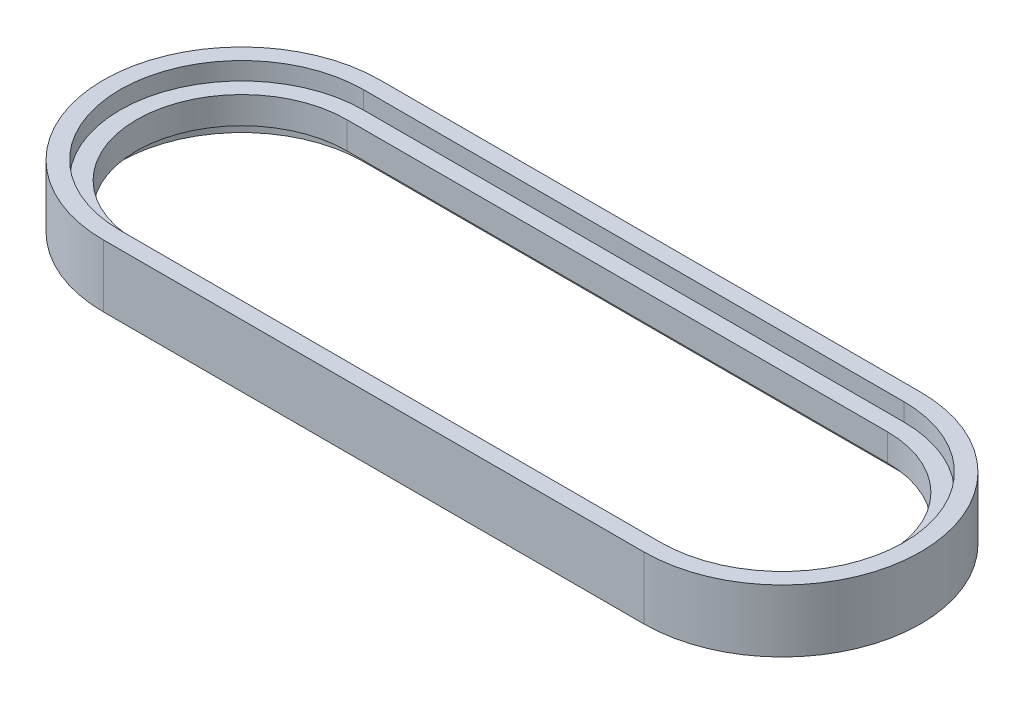
ISO-10303-21;
HEADER;
FILE_DESCRIPTION(('STEP AP214'),'2;1');
FILE_NAME('part.step','',(''),(''),'','','');
FILE_SCHEMA(('AUTOMOTIVE_DESIGN { 1 0 10303 214 1 1 1 1 }'));
ENDSEC;
DATA;
#1=APPLICATION_CONTEXT('core data for automotive mechanical design processes');
#2=APPLICATION_PROTOCOL_DEFINITION('international standard','automotive_design',2000,#1);
#3=PRODUCT_CONTEXT('',#1,'mechanical');
#4=PRODUCT('Part','Part','',(#3));
#5=PRODUCT_RELATED_PRODUCT_CATEGORY('part','',(#4));
#6=PRODUCT_DEFINITION_FORMATION('','',#4);
#7=PRODUCT_DEFINITION_CONTEXT('part definition',#1,'design');
#8=PRODUCT_DEFINITION('design','',#6,#7);
#9=PRODUCT_DEFINITION_SHAPE('','',#8);
#10=(LENGTH_UNIT() NAMED_UNIT(*) SI_UNIT(.MILLI.,.METRE.));
#11=(NAMED_UNIT(*) PLANE_ANGLE_UNIT() SI_UNIT($,.RADIAN.));
#12=(NAMED_UNIT(*) SI_UNIT($,.STERADIAN.) SOLID_ANGLE_UNIT());
#13=UNCERTAINTY_MEASURE_WITH_UNIT(LENGTH_MEASURE(1.E-05),#10,'distance_accuracy_value','');
#14=(GEOMETRIC_REPRESENTATION_CONTEXT(3) GLOBAL_UNCERTAINTY_ASSIGNED_CONTEXT((#13)) GLOBAL_UNIT_ASSIGNED_CONTEXT((#10,
#11,#12)) REPRESENTATION_CONTEXT('',''));
#15=CARTESIAN_POINT('',(0.,0.,0.));
#16=DIRECTION('',(0.,0.,1.));
#17=DIRECTION('',(1.,0.,0.));
#18=AXIS2_PLACEMENT_3D('',#15,#16,#17);
#19=CARTESIAN_POINT('',(0.,30.,0.));
#20=DIRECTION('',(0.,-1.,0.));
#21=DIRECTION('',(0.,0.,-1.));
#22=AXIS2_PLACEMENT_3D('',#19,#20,#21);
#23=CYLINDRICAL_SURFACE('',#22,58.57);
#24=DIRECTION('',(0.,-1.,0.));
#25=VECTOR('',#24,1.);
#26=CARTESIAN_POINT('',(0.,30.,58.57));
#27=LINE('',#26,#25);
#28=CARTESIAN_POINT('',(0.,30.,58.57));
#29=VERTEX_POINT('',#28);
#30=CARTESIAN_POINT('',(0.,21.5,58.57));
#31=VERTEX_POINT('',#30);
#32=EDGE_CURVE('E288',#29,#31,#27,.T.);
#33=ORIENTED_EDGE('',*,*,#32,.T.);
#34=CARTESIAN_POINT('',(0.,21.5,0.));
#35=DIRECTION('',(0.,-1.,0.));
#36=DIRECTION('',(0.,0.,-1.));
#37=AXIS2_PLACEMENT_3D('',#34,#35,#36);
#38=CIRCLE('',#37,58.57);
#39=CARTESIAN_POINT('',(0.,21.5,-58.57));
#40=VERTEX_POINT('',#39);
#41=EDGE_CURVE('E222',#31,#40,#38,.T.);
#42=ORIENTED_EDGE('',*,*,#41,.T.);
#43=DIRECTION('',(0.,-1.,0.));
#44=VECTOR('',#43,1.);
#45=CARTESIAN_POINT('',(0.,30.,-58.57));
#46=LINE('',#45,#44);
#47=CARTESIAN_POINT('',(0.,30.,-58.57));
#48=VERTEX_POINT('',#47);
#49=EDGE_CURVE('E273',#48,#40,#46,.T.);
#50=ORIENTED_EDGE('',*,*,#49,.F.);
#51=CARTESIAN_POINT('',(0.,30.,0.));
#52=DIRECTION('',(0.,1.,0.));
#53=DIRECTION('',(0.,0.,1.));
#54=AXIS2_PLACEMENT_3D('',#51,#52,#53);
#55=CIRCLE('',#54,58.57);
#56=EDGE_CURVE('E244',#48,#29,#55,.T.);
#57=ORIENTED_EDGE('',*,*,#56,.T.);
#58=EDGE_LOOP('',(#33,#42,#50,#57));
#59=FACE_BOUND('',#58,.T.);
#60=ADVANCED_FACE('F45',(#59),#23,.F.);
#61=CARTESIAN_POINT('',(0.,30.,58.57));
#62=DIRECTION('',(0.,0.,-1.));
#63=DIRECTION('',(-1.,0.,0.));
#64=AXIS2_PLACEMENT_3D('',#61,#62,#63);
#65=PLANE('',#64);
#66=DIRECTION('',(0.,-1.,0.));
#67=VECTOR('',#66,1.);
#68=CARTESIAN_POINT('',(260.,30.,58.57));
#69=LINE('',#68,#67);
#70=CARTESIAN_POINT('',(260.,30.,58.57));
#71=VERTEX_POINT('',#70);
#72=CARTESIAN_POINT('',(260.,21.5,58.57));
#73=VERTEX_POINT('',#72);
#74=EDGE_CURVE('E283',#71,#73,#69,.T.);
#75=ORIENTED_EDGE('',*,*,#74,.T.);
#76=DIRECTION('',(-1.,0.,0.));
#77=VECTOR('',#76,1.);
#78=CARTESIAN_POINT('',(0.,21.5,58.57));
#79=LINE('',#78,#77);
#80=EDGE_CURVE('E239',#73,#31,#79,.T.);
#81=ORIENTED_EDGE('',*,*,#80,.T.);
#82=ORIENTED_EDGE('',*,*,#32,.F.);
#83=DIRECTION('',(1.,0.,0.));
#84=VECTOR('',#83,1.);
#85=CARTESIAN_POINT('',(0.,30.,58.57));
#86=LINE('',#85,#84);
#87=EDGE_CURVE('E247',#29,#71,#86,.T.);
#88=ORIENTED_EDGE('',*,*,#87,.T.);
#89=EDGE_LOOP('',(#75,#81,#82,#88));
#90=FACE_BOUND('',#89,.T.);
#91=ADVANCED_FACE('F357',(#90),#65,.T.);
#92=CARTESIAN_POINT('',(260.,30.,0.));
#93=DIRECTION('',(0.,-1.,0.));
#94=DIRECTION('',(0.,0.,-1.));
#95=AXIS2_PLACEMENT_3D('',#92,#93,#94);
#96=CYLINDRICAL_SURFACE('',#95,58.57);
#97=DIRECTION('',(0.,-1.,0.));
#98=VECTOR('',#97,1.);
#99=CARTESIAN_POINT('',(260.,30.,-58.57));
#100=LINE('',#99,#98);
#101=CARTESIAN_POINT('',(260.,30.,-58.57));
#102=VERTEX_POINT('',#101);
#103=CARTESIAN_POINT('',(260.,21.5,-58.57));
#104=VERTEX_POINT('',#103);
#105=EDGE_CURVE('E278',#102,#104,#100,.T.);
#106=ORIENTED_EDGE('',*,*,#105,.T.);
#107=CARTESIAN_POINT('',(260.,21.5,0.));
#108=DIRECTION('',(0.,-1.,0.));
#109=DIRECTION('',(0.,0.,-1.));
#110=AXIS2_PLACEMENT_3D('',#107,#108,#109);
#111=CIRCLE('',#110,58.57);
#112=EDGE_CURVE('E235',#104,#73,#111,.T.);
#113=ORIENTED_EDGE('',*,*,#112,.T.);
#114=ORIENTED_EDGE('',*,*,#74,.F.);
#115=CARTESIAN_POINT('',(260.,30.,0.));
#116=DIRECTION('',(0.,1.,0.));
#117=DIRECTION('',(0.,0.,1.));
#118=AXIS2_PLACEMENT_3D('',#115,#116,#117);
#119=CIRCLE('',#118,58.57);
#120=EDGE_CURVE('E251',#71,#102,#119,.T.);
#121=ORIENTED_EDGE('',*,*,#120,.T.);
#122=EDGE_LOOP('',(#106,#113,#114,#121));
#123=FACE_BOUND('',#122,.T.);
#124=ADVANCED_FACE('F364',(#123),#96,.F.);
#125=CARTESIAN_POINT('',(0.,30.,-58.57));
#126=DIRECTION('',(0.,0.,1.));
#127=DIRECTION('',(1.,0.,0.));
#128=AXIS2_PLACEMENT_3D('',#125,#126,#127);
#129=PLANE('',#128);
#130=ORIENTED_EDGE('',*,*,#49,.T.);
#131=DIRECTION('',(1.,0.,0.));
#132=VECTOR('',#131,1.);
#133=CARTESIAN_POINT('',(0.,21.5,-58.57));
#134=LINE('',#133,#132);
#135=EDGE_CURVE('E231',#40,#104,#134,.T.);
#136=ORIENTED_EDGE('',*,*,#135,.T.);
#137=ORIENTED_EDGE('',*,*,#105,.F.);
#138=DIRECTION('',(-1.,0.,0.));
#139=VECTOR('',#138,1.);
#140=CARTESIAN_POINT('',(0.,30.,-58.57));
#141=LINE('',#140,#139);
#142=EDGE_CURVE('E255',#102,#48,#141,.T.);
#143=ORIENTED_EDGE('',*,*,#142,.T.);
#144=EDGE_LOOP('',(#130,#136,#137,#143));
#145=FACE_BOUND('',#144,.T.);
#146=ADVANCED_FACE('F381',(#145),#129,.T.);
#147=CARTESIAN_POINT('',(0.,30.,0.));
#148=DIRECTION('',(0.,1.,0.));
#149=DIRECTION('',(0.,0.,1.));
#150=AXIS2_PLACEMENT_3D('',#147,#148,#149);
#151=PLANE('',#150);
#152=CARTESIAN_POINT('',(0.,30.,0.));
#153=DIRECTION('',(0.,1.,0.));
#154=DIRECTION('',(0.,0.,1.));
#155=AXIS2_PLACEMENT_3D('',#152,#153,#154);
#156=CIRCLE('',#155,66.57);
#157=CARTESIAN_POINT('',(0.,30.,-66.57));
#158=VERTEX_POINT('',#157);
#159=CARTESIAN_POINT('',(0.,30.,66.57));
#160=VERTEX_POINT('',#159);
#161=EDGE_CURVE('E293',#158,#160,#156,.T.);
#162=ORIENTED_EDGE('',*,*,#161,.T.);
#163=DIRECTION('',(1.,0.,0.));
#164=VECTOR('',#163,1.);
#165=CARTESIAN_POINT('',(0.,30.,66.57));
#166=LINE('',#165,#164);
#167=CARTESIAN_POINT('',(260.,30.,66.57));
#168=VERTEX_POINT('',#167);
#169=EDGE_CURVE('E297',#160,#168,#166,.T.);
#170=ORIENTED_EDGE('',*,*,#169,.T.);
#171=CARTESIAN_POINT('',(260.,30.,0.));
#172=DIRECTION('',(0.,1.,0.));
#173=DIRECTION('',(0.,0.,1.));
#174=AXIS2_PLACEMENT_3D('',#171,#172,#173);
#175=CIRCLE('',#174,66.57);
#176=CARTESIAN_POINT('',(260.,30.,-66.57));
#177=VERTEX_POINT('',#176);
#178=EDGE_CURVE('E301',#168,#177,#175,.T.);
#179=ORIENTED_EDGE('',*,*,#178,.T.);
#180=DIRECTION('',(-1.,0.,0.));
#181=VECTOR('',#180,1.);
#182=CARTESIAN_POINT('',(0.,30.,-66.57));
#183=LINE('',#182,#181);
#184=EDGE_CURVE('E304',#177,#158,#183,.T.);
#185=ORIENTED_EDGE('',*,*,#184,.T.);
#186=EDGE_LOOP('',(#162,#170,#179,#185));
#187=FACE_BOUND('',#186,.T.);
#188=ORIENTED_EDGE('',*,*,#87,.F.);
#189=ORIENTED_EDGE('',*,*,#56,.F.);
#190=ORIENTED_EDGE('',*,*,#142,.F.);
#191=ORIENTED_EDGE('',*,*,#120,.F.);
#192=EDGE_LOOP('',(#188,#189,#190,#191));
#193=FACE_BOUND('',#192,.T.);
#194=ADVANCED_FACE('F347',(#187,#193),#151,.T.);
#195=CARTESIAN_POINT('',(0.,0.,0.));
#196=DIRECTION('',(0.,1.,0.));
#197=DIRECTION('',(0.,0.,1.));
#198=AXIS2_PLACEMENT_3D('',#195,#196,#197);
#199=PLANE('',#198);
#200=CARTESIAN_POINT('',(0.,0.,0.));
#201=DIRECTION('',(0.,1.,0.));
#202=DIRECTION('',(0.,0.,1.));
#203=AXIS2_PLACEMENT_3D('',#200,#201,#202);
#204=CIRCLE('',#203,66.57);
#205=CARTESIAN_POINT('',(0.,0.,-66.57));
#206=VERTEX_POINT('',#205);
#207=CARTESIAN_POINT('',(0.,0.,66.57));
#208=VERTEX_POINT('',#207);
#209=EDGE_CURVE('E292',#206,#208,#204,.T.);
#210=ORIENTED_EDGE('',*,*,#209,.F.);
#211=DIRECTION('',(-1.,0.,0.));
#212=VECTOR('',#211,1.);
#213=CARTESIAN_POINT('',(0.,0.,-66.57));
#214=LINE('',#213,#212);
#215=CARTESIAN_POINT('',(260.,0.,-66.57));
#216=VERTEX_POINT('',#215);
#217=EDGE_CURVE('E298',#216,#206,#214,.T.);
#218=ORIENTED_EDGE('',*,*,#217,.F.);
#219=CARTESIAN_POINT('',(260.,0.,0.));
#220=DIRECTION('',(0.,1.,0.));
#221=DIRECTION('',(0.,0.,1.));
#222=AXIS2_PLACEMENT_3D('',#219,#220,#221);
#223=CIRCLE('',#222,66.57);
#224=CARTESIAN_POINT('',(260.,0.,66.57));
#225=VERTEX_POINT('',#224);
#226=EDGE_CURVE('E314',#225,#216,#223,.T.);
#227=ORIENTED_EDGE('',*,*,#226,.F.);
#228=DIRECTION('',(1.,0.,0.));
#229=VECTOR('',#228,1.);
#230=CARTESIAN_POINT('',(0.,0.,66.57));
#231=LINE('',#230,#229);
#232=EDGE_CURVE('E311',#208,#225,#231,.T.);
#233=ORIENTED_EDGE('',*,*,#232,.F.);
#234=EDGE_LOOP('',(#210,#218,#227,#233));
#235=FACE_BOUND('',#234,.T.);
#236=CARTESIAN_POINT('',(0.,0.,0.));
#237=DIRECTION('',(0.,1.,0.));
#238=DIRECTION('',(0.,0.,1.));
#239=AXIS2_PLACEMENT_3D('',#236,#237,#238);
#240=CIRCLE('',#239,58.57);
#241=CARTESIAN_POINT('',(0.,0.,-58.57));
#242=VERTEX_POINT('',#241);
#243=CARTESIAN_POINT('',(0.,0.,58.57));
#244=VERTEX_POINT('',#243);
#245=EDGE_CURVE('E243',#242,#244,#240,.T.);
#246=ORIENTED_EDGE('',*,*,#245,.T.);
#247=DIRECTION('',(1.,0.,0.));
#248=VECTOR('',#247,1.);
#249=CARTESIAN_POINT('',(0.,0.,58.57));
#250=LINE('',#249,#248);
#251=CARTESIAN_POINT('',(260.,0.,58.57));
#252=VERTEX_POINT('',#251);
#253=EDGE_CURVE('E262',#244,#252,#250,.T.);
#254=ORIENTED_EDGE('',*,*,#253,.T.);
#255=CARTESIAN_POINT('',(260.,0.,0.));
#256=DIRECTION('',(0.,1.,0.));
#257=DIRECTION('',(0.,0.,1.));
#258=AXIS2_PLACEMENT_3D('',#255,#256,#257);
#259=CIRCLE('',#258,58.57);
#260=CARTESIAN_POINT('',(260.,0.,-58.57));
#261=VERTEX_POINT('',#260);
#262=EDGE_CURVE('E266',#252,#261,#259,.T.);
#263=ORIENTED_EDGE('',*,*,#262,.T.);
#264=DIRECTION('',(-1.,0.,0.));
#265=VECTOR('',#264,1.);
#266=CARTESIAN_POINT('',(0.,0.,-58.57));
#267=LINE('',#266,#265);
#268=EDGE_CURVE('E248',#261,#242,#267,.T.);
#269=ORIENTED_EDGE('',*,*,#268,.T.);
#270=EDGE_LOOP('',(#246,#254,#263,#269));
#271=FACE_BOUND('',#270,.T.);
#272=ADVANCED_FACE('F337',(#235,#271),#199,.F.);
#273=CARTESIAN_POINT('',(0.,30.,0.));
#274=DIRECTION('',(0.,-1.,0.));
#275=DIRECTION('',(0.,0.,-1.));
#276=AXIS2_PLACEMENT_3D('',#273,#274,#275);
#277=CYLINDRICAL_SURFACE('',#276,66.57);
#278=ORIENTED_EDGE('',*,*,#209,.T.);
#279=DIRECTION('',(0.,-1.,0.));
#280=VECTOR('',#279,1.);
#281=CARTESIAN_POINT('',(0.,30.,66.57));
#282=LINE('',#281,#280);
#283=EDGE_CURVE('E11',#160,#208,#282,.T.);
#284=ORIENTED_EDGE('',*,*,#283,.F.);
#285=ORIENTED_EDGE('',*,*,#161,.F.);
#286=DIRECTION('',(0.,-1.,0.));
#287=VECTOR('',#286,1.);
#288=CARTESIAN_POINT('',(0.,30.,-66.57));
#289=LINE('',#288,#287);
#290=EDGE_CURVE('E307',#158,#206,#289,.T.);
#291=ORIENTED_EDGE('',*,*,#290,.T.);
#292=EDGE_LOOP('',(#278,#284,#285,#291));
#293=FACE_BOUND('',#292,.T.);
#294=ADVANCED_FACE('F47',(#293),#277,.T.);
#295=CARTESIAN_POINT('',(0.,30.,66.57));
#296=DIRECTION('',(0.,0.,-1.));
#297=DIRECTION('',(-1.,0.,0.));
#298=AXIS2_PLACEMENT_3D('',#295,#296,#297);
#299=PLANE('',#298);
#300=ORIENTED_EDGE('',*,*,#232,.T.);
#301=DIRECTION('',(0.,-1.,0.));
#302=VECTOR('',#301,1.);
#303=CARTESIAN_POINT('',(260.,30.,66.57));
#304=LINE('',#303,#302);
#305=EDGE_CURVE('E54',#168,#225,#304,.T.);
#306=ORIENTED_EDGE('',*,*,#305,.F.);
#307=ORIENTED_EDGE('',*,*,#169,.F.);
#308=ORIENTED_EDGE('',*,*,#283,.T.);
#309=EDGE_LOOP('',(#300,#306,#307,#308));
#310=FACE_BOUND('',#309,.T.);
#311=ADVANCED_FACE('F349',(#310),#299,.F.);
#312=CARTESIAN_POINT('',(260.,30.,0.));
#313=DIRECTION('',(0.,-1.,0.));
#314=DIRECTION('',(0.,0.,-1.));
#315=AXIS2_PLACEMENT_3D('',#312,#313,#314);
#316=CYLINDRICAL_SURFACE('',#315,66.57);
#317=ORIENTED_EDGE('',*,*,#226,.T.);
#318=DIRECTION('',(0.,-1.,0.));
#319=VECTOR('',#318,1.);
#320=CARTESIAN_POINT('',(260.,30.,-66.57));
#321=LINE('',#320,#319);
#322=EDGE_CURVE('E322',#177,#216,#321,.T.);
#323=ORIENTED_EDGE('',*,*,#322,.F.);
#324=ORIENTED_EDGE('',*,*,#178,.F.);
#325=ORIENTED_EDGE('',*,*,#305,.T.);
#326=EDGE_LOOP('',(#317,#323,#324,#325));
#327=FACE_BOUND('',#326,.T.);
#328=ADVANCED_FACE('F331',(#327),#316,.T.);
#329=CARTESIAN_POINT('',(0.,30.,-66.57));
#330=DIRECTION('',(0.,0.,1.));
#331=DIRECTION('',(1.,0.,0.));
#332=AXIS2_PLACEMENT_3D('',#329,#330,#331);
#333=PLANE('',#332);
#334=ORIENTED_EDGE('',*,*,#217,.T.);
#335=ORIENTED_EDGE('',*,*,#290,.F.);
#336=ORIENTED_EDGE('',*,*,#184,.F.);
#337=ORIENTED_EDGE('',*,*,#322,.T.);
#338=EDGE_LOOP('',(#334,#335,#336,#337));
#339=FACE_BOUND('',#338,.T.);
#340=ADVANCED_FACE('F341',(#339),#333,.F.);
#341=CARTESIAN_POINT('',(0.,8.5,0.));
#342=DIRECTION('',(0.,-1.,0.));
#343=DIRECTION('',(0.,0.,-1.));
#344=AXIS2_PLACEMENT_3D('',#341,#342,#343);
#345=CIRCLE('',#344,58.57);
#346=CARTESIAN_POINT('',(0.,8.5,58.57));
#347=VERTEX_POINT('',#346);
#348=CARTESIAN_POINT('',(0.,8.5,-58.57));
#349=VERTEX_POINT('',#348);
#350=EDGE_CURVE('E61',#347,#349,#345,.T.);
#351=ORIENTED_EDGE('',*,*,#350,.F.);
#352=EDGE_CURVE('E287',#347,#244,#27,.T.);
#353=ORIENTED_EDGE('',*,*,#352,.T.);
#354=ORIENTED_EDGE('',*,*,#245,.F.);
#355=EDGE_CURVE('E258',#349,#242,#46,.T.);
#356=ORIENTED_EDGE('',*,*,#355,.F.);
#357=EDGE_LOOP('',(#351,#353,#354,#356));
#358=FACE_BOUND('',#357,.T.);
#359=ADVANCED_FACE('F360',(#358),#23,.F.);
#360=DIRECTION('',(-1.,0.,0.));
#361=VECTOR('',#360,1.);
#362=CARTESIAN_POINT('',(0.,8.5,58.57));
#363=LINE('',#362,#361);
#364=CARTESIAN_POINT('',(260.,8.5,58.57));
#365=VERTEX_POINT('',#364);
#366=EDGE_CURVE('E68',#365,#347,#363,.T.);
#367=ORIENTED_EDGE('',*,*,#366,.F.);
#368=EDGE_CURVE('E282',#365,#252,#69,.T.);
#369=ORIENTED_EDGE('',*,*,#368,.T.);
#370=ORIENTED_EDGE('',*,*,#253,.F.);
#371=ORIENTED_EDGE('',*,*,#352,.F.);
#372=EDGE_LOOP('',(#367,#369,#370,#371));
#373=FACE_BOUND('',#372,.T.);
#374=ADVANCED_FACE('F367',(#373),#65,.T.);
#375=CARTESIAN_POINT('',(260.,8.5,0.));
#376=DIRECTION('',(0.,-1.,0.));
#377=DIRECTION('',(0.,0.,-1.));
#378=AXIS2_PLACEMENT_3D('',#375,#376,#377);
#379=CIRCLE('',#378,58.57);
#380=CARTESIAN_POINT('',(260.,8.5,-58.57));
#381=VERTEX_POINT('',#380);
#382=EDGE_CURVE('E202',#381,#365,#379,.T.);
#383=ORIENTED_EDGE('',*,*,#382,.F.);
#384=EDGE_CURVE('E277',#381,#261,#100,.T.);
#385=ORIENTED_EDGE('',*,*,#384,.T.);
#386=ORIENTED_EDGE('',*,*,#262,.F.);
#387=ORIENTED_EDGE('',*,*,#368,.F.);
#388=EDGE_LOOP('',(#383,#385,#386,#387));
#389=FACE_BOUND('',#388,.T.);
#390=ADVANCED_FACE('F374',(#389),#96,.F.);
#391=DIRECTION('',(1.,0.,0.));
#392=VECTOR('',#391,1.);
#393=CARTESIAN_POINT('',(0.,8.5,-58.57));
#394=LINE('',#393,#392);
#395=EDGE_CURVE('E198',#349,#381,#394,.T.);
#396=ORIENTED_EDGE('',*,*,#395,.F.);
#397=ORIENTED_EDGE('',*,*,#355,.T.);
#398=ORIENTED_EDGE('',*,*,#268,.F.);
#399=ORIENTED_EDGE('',*,*,#384,.F.);
#400=EDGE_LOOP('',(#396,#397,#398,#399));
#401=FACE_BOUND('',#400,.T.);
#402=ADVANCED_FACE('F387',(#401),#129,.T.);
#403=CARTESIAN_POINT('',(0.,21.5,0.));
#404=DIRECTION('',(0.,-1.,0.));
#405=DIRECTION('',(0.,0.,-1.));
#406=AXIS2_PLACEMENT_3D('',#403,#404,#405);
#407=PLANE('',#406);
#408=DIRECTION('',(-1.,0.,0.));
#409=VECTOR('',#408,1.);
#410=CARTESIAN_POINT('',(0.,21.5,50.57));
#411=LINE('',#410,#409);
#412=CARTESIAN_POINT('',(260.,21.5,50.57));
#413=VERTEX_POINT('',#412);
#414=CARTESIAN_POINT('',(0.,21.5,50.57));
#415=VERTEX_POINT('',#414);
#416=EDGE_CURVE('E174',#413,#415,#411,.T.);
#417=ORIENTED_EDGE('',*,*,#416,.T.);
#418=CARTESIAN_POINT('',(0.,21.5,0.));
#419=DIRECTION('',(0.,-1.,0.));
#420=DIRECTION('',(0.,0.,-1.));
#421=AXIS2_PLACEMENT_3D('',#418,#419,#420);
#422=CIRCLE('',#421,50.57);
#423=CARTESIAN_POINT('',(0.,21.5,-50.57));
#424=VERTEX_POINT('',#423);
#425=EDGE_CURVE('E208',#415,#424,#422,.T.);
#426=ORIENTED_EDGE('',*,*,#425,.T.);
#427=DIRECTION('',(1.,0.,0.));
#428=VECTOR('',#427,1.);
#429=CARTESIAN_POINT('',(0.,21.5,-50.57));
#430=LINE('',#429,#428);
#431=CARTESIAN_POINT('',(260.,21.5,-50.57));
#432=VERTEX_POINT('',#431);
#433=EDGE_CURVE('E168',#424,#432,#430,.T.);
#434=ORIENTED_EDGE('',*,*,#433,.T.);
#435=CARTESIAN_POINT('',(260.,21.5,0.));
#436=DIRECTION('',(0.,-1.,0.));
#437=DIRECTION('',(0.,0.,-1.));
#438=AXIS2_PLACEMENT_3D('',#435,#436,#437);
#439=CIRCLE('',#438,50.57);
#440=EDGE_CURVE('E213',#432,#413,#439,.T.);
#441=ORIENTED_EDGE('',*,*,#440,.T.);
#442=EDGE_LOOP('',(#417,#426,#434,#441));
#443=FACE_BOUND('',#442,.T.);
#444=ORIENTED_EDGE('',*,*,#41,.F.);
#445=ORIENTED_EDGE('',*,*,#80,.F.);
#446=ORIENTED_EDGE('',*,*,#112,.F.);
#447=ORIENTED_EDGE('',*,*,#135,.F.);
#448=EDGE_LOOP('',(#444,#445,#446,#447));
#449=FACE_BOUND('',#448,.T.);
#450=ADVANCED_FACE('F395',(#443,#449),#407,.F.);
#451=CARTESIAN_POINT('',(0.,21.5,0.));
#452=DIRECTION('',(0.,-1.,0.));
#453=DIRECTION('',(0.,0.,-1.));
#454=AXIS2_PLACEMENT_3D('',#451,#452,#453);
#455=CYLINDRICAL_SURFACE('',#454,50.57);
#456=DIRECTION('',(0.,-1.,0.));
#457=VECTOR('',#456,1.);
#458=CARTESIAN_POINT('',(0.,21.5,50.57));
#459=LINE('',#458,#457);
#460=CARTESIAN_POINT('',(0.,8.5,50.57));
#461=VERTEX_POINT('',#460);
#462=EDGE_CURVE('E179',#415,#461,#459,.T.);
#463=ORIENTED_EDGE('',*,*,#462,.T.);
#464=CARTESIAN_POINT('',(0.,8.5,0.));
#465=DIRECTION('',(0.,-1.,0.));
#466=DIRECTION('',(0.,0.,-1.));
#467=AXIS2_PLACEMENT_3D('',#464,#465,#466);
#468=CIRCLE('',#467,50.57);
#469=CARTESIAN_POINT('',(0.,8.5,-50.57));
#470=VERTEX_POINT('',#469);
#471=EDGE_CURVE('E177',#461,#470,#468,.T.);
#472=ORIENTED_EDGE('',*,*,#471,.T.);
#473=DIRECTION('',(0.,-1.,0.));
#474=VECTOR('',#473,1.);
#475=CARTESIAN_POINT('',(0.,21.5,-50.57));
#476=LINE('',#475,#474);
#477=EDGE_CURVE('E160',#424,#470,#476,.T.);
#478=ORIENTED_EDGE('',*,*,#477,.F.);
#479=ORIENTED_EDGE('',*,*,#425,.F.);
#480=EDGE_LOOP('',(#463,#472,#478,#479));
#481=FACE_BOUND('',#480,.T.);
#482=ADVANCED_FACE('F178',(#481),#455,.F.);
#483=CARTESIAN_POINT('',(0.,21.5,50.57));
#484=DIRECTION('',(0.,0.,1.));
#485=DIRECTION('',(1.,0.,0.));
#486=AXIS2_PLACEMENT_3D('',#483,#484,#485);
#487=PLANE('',#486);
#488=DIRECTION('',(0.,-1.,0.));
#489=VECTOR('',#488,1.);
#490=CARTESIAN_POINT('',(260.,21.5,50.57));
#491=LINE('',#490,#489);
#492=CARTESIAN_POINT('',(260.,8.5,50.57));
#493=VERTEX_POINT('',#492);
#494=EDGE_CURVE('E223',#413,#493,#491,.T.);
#495=ORIENTED_EDGE('',*,*,#494,.T.);
#496=DIRECTION('',(-1.,0.,0.));
#497=VECTOR('',#496,1.);
#498=CARTESIAN_POINT('',(0.,8.5,50.57));
#499=LINE('',#498,#497);
#500=EDGE_CURVE('E191',#493,#461,#499,.T.);
#501=ORIENTED_EDGE('',*,*,#500,.T.);
#502=ORIENTED_EDGE('',*,*,#462,.F.);
#503=ORIENTED_EDGE('',*,*,#416,.F.);
#504=EDGE_LOOP('',(#495,#501,#502,#503));
#505=FACE_BOUND('',#504,.T.);
#506=ADVANCED_FACE('F421',(#505),#487,.F.);
#507=CARTESIAN_POINT('',(260.,21.5,0.));
#508=DIRECTION('',(0.,-1.,0.));
#509=DIRECTION('',(0.,0.,-1.));
#510=AXIS2_PLACEMENT_3D('',#507,#508,#509);
#511=CYLINDRICAL_SURFACE('',#510,50.57);
#512=DIRECTION('',(0.,-1.,0.));
#513=VECTOR('',#512,1.);
#514=CARTESIAN_POINT('',(260.,21.5,-50.57));
#515=LINE('',#514,#513);
#516=CARTESIAN_POINT('',(260.,8.5,-50.57));
#517=VERTEX_POINT('',#516);
#518=EDGE_CURVE('E173',#432,#517,#515,.T.);
#519=ORIENTED_EDGE('',*,*,#518,.T.);
#520=CARTESIAN_POINT('',(260.,8.5,0.));
#521=DIRECTION('',(0.,-1.,0.));
#522=DIRECTION('',(0.,0.,-1.));
#523=AXIS2_PLACEMENT_3D('',#520,#521,#522);
#524=CIRCLE('',#523,50.57);
#525=EDGE_CURVE('E187',#517,#493,#524,.T.);
#526=ORIENTED_EDGE('',*,*,#525,.T.);
#527=ORIENTED_EDGE('',*,*,#494,.F.);
#528=ORIENTED_EDGE('',*,*,#440,.F.);
#529=EDGE_LOOP('',(#519,#526,#527,#528));
#530=FACE_BOUND('',#529,.T.);
#531=ADVANCED_FACE('F418',(#530),#511,.F.);
#532=CARTESIAN_POINT('',(0.,21.5,-50.57));
#533=DIRECTION('',(0.,0.,-1.));
#534=DIRECTION('',(-1.,0.,0.));
#535=AXIS2_PLACEMENT_3D('',#532,#533,#534);
#536=PLANE('',#535);
#537=ORIENTED_EDGE('',*,*,#477,.T.);
#538=DIRECTION('',(1.,0.,0.));
#539=VECTOR('',#538,1.);
#540=CARTESIAN_POINT('',(0.,8.5,-50.57));
#541=LINE('',#540,#539);
#542=EDGE_CURVE('E165',#470,#517,#541,.T.);
#543=ORIENTED_EDGE('',*,*,#542,.T.);
#544=ORIENTED_EDGE('',*,*,#518,.F.);
#545=ORIENTED_EDGE('',*,*,#433,.F.);
#546=EDGE_LOOP('',(#537,#543,#544,#545));
#547=FACE_BOUND('',#546,.T.);
#548=ADVANCED_FACE('F162',(#547),#536,.F.);
#549=CARTESIAN_POINT('',(0.,8.5,0.));
#550=DIRECTION('',(0.,-1.,0.));
#551=DIRECTION('',(0.,0.,-1.));
#552=AXIS2_PLACEMENT_3D('',#549,#550,#551);
#553=PLANE('',#552);
#554=ORIENTED_EDGE('',*,*,#350,.T.);
#555=ORIENTED_EDGE('',*,*,#395,.T.);
#556=ORIENTED_EDGE('',*,*,#382,.T.);
#557=ORIENTED_EDGE('',*,*,#366,.T.);
#558=EDGE_LOOP('',(#554,#555,#556,#557));
#559=FACE_BOUND('',#558,.T.);
#560=ORIENTED_EDGE('',*,*,#542,.F.);
#561=ORIENTED_EDGE('',*,*,#471,.F.);
#562=ORIENTED_EDGE('',*,*,#500,.F.);
#563=ORIENTED_EDGE('',*,*,#525,.F.);
#564=EDGE_LOOP('',(#560,#561,#562,#563));
#565=FACE_BOUND('',#564,.T.);
#566=ADVANCED_FACE('F185',(#559,#565),#553,.T.);
#567=CLOSED_SHELL('',(#60,#91,#124,#146,#194,#272,#294,#311,#328,#340,#359,#374,#390,#402,#450,
#482,#506,#531,#548,#566));
#568=MANIFOLD_SOLID_BREP('B2',#567);
#569=ADVANCED_BREP_SHAPE_REPRESENTATION('',(#18,#568),#14);
#570=SHAPE_DEFINITION_REPRESENTATION(#9,#569);
ENDSEC;
END-ISO-10303-21;
